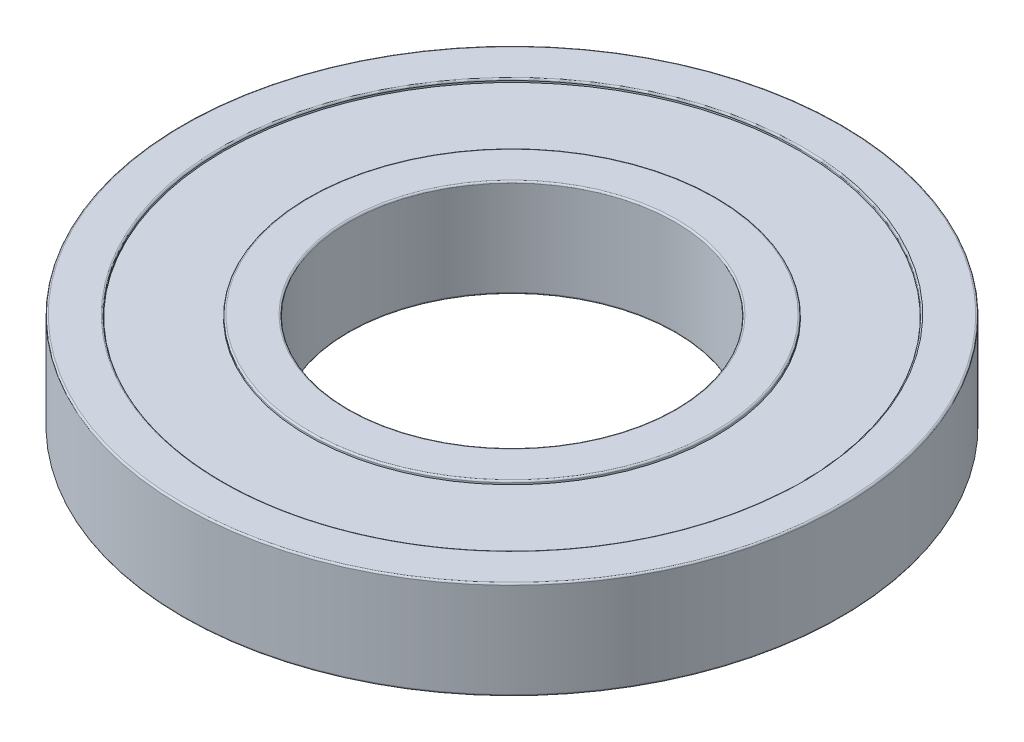
ISO-10303-21;
HEADER;
FILE_DESCRIPTION(('STEP AP214'),'2;1');
FILE_NAME('part.step','',(''),(''),'','','');
FILE_SCHEMA(('AUTOMOTIVE_DESIGN { 1 0 10303 214 1 1 1 1 }'));
ENDSEC;
DATA;
#1=APPLICATION_CONTEXT('core data for automotive mechanical design processes');
#2=APPLICATION_PROTOCOL_DEFINITION('international standard','automotive_design',2000,#1);
#3=PRODUCT_CONTEXT('',#1,'mechanical');
#4=PRODUCT('Part','Part','',(#3));
#5=PRODUCT_RELATED_PRODUCT_CATEGORY('part','',(#4));
#6=PRODUCT_DEFINITION_FORMATION('','',#4);
#7=PRODUCT_DEFINITION_CONTEXT('part definition',#1,'design');
#8=PRODUCT_DEFINITION('design','',#6,#7);
#9=PRODUCT_DEFINITION_SHAPE('','',#8);
#10=(LENGTH_UNIT() NAMED_UNIT(*) SI_UNIT(.MILLI.,.METRE.));
#11=(NAMED_UNIT(*) PLANE_ANGLE_UNIT() SI_UNIT($,.RADIAN.));
#12=(NAMED_UNIT(*) SI_UNIT($,.STERADIAN.) SOLID_ANGLE_UNIT());
#13=UNCERTAINTY_MEASURE_WITH_UNIT(LENGTH_MEASURE(1.E-05),#10,'distance_accuracy_value','');
#14=(GEOMETRIC_REPRESENTATION_CONTEXT(3) GLOBAL_UNCERTAINTY_ASSIGNED_CONTEXT((#13)) GLOBAL_UNIT_ASSIGNED_CONTEXT((#10,
#11,#12)) REPRESENTATION_CONTEXT('',''));
#15=CARTESIAN_POINT('',(0.,0.,0.));
#16=DIRECTION('',(0.,0.,1.));
#17=DIRECTION('',(1.,0.,0.));
#18=AXIS2_PLACEMENT_3D('',#15,#16,#17);
#19=CARTESIAN_POINT('',(0.,0.,0.));
#20=DIRECTION('',(0.,-1.,0.));
#21=DIRECTION('',(0.,0.,-1.));
#22=AXIS2_PLACEMENT_3D('',#19,#20,#21);
#23=CYLINDRICAL_SURFACE('',#22,6.25);
#24=CARTESIAN_POINT('',(0.,-1.45,0.));
#25=DIRECTION('',(0.,1.,0.));
#26=DIRECTION('',(0.,0.,1.));
#27=AXIS2_PLACEMENT_3D('',#24,#25,#26);
#28=CIRCLE('',#27,6.25);
#29=CARTESIAN_POINT('',(0.,-1.45,6.25));
#30=VERTEX_POINT('',#29);
#31=EDGE_CURVE('E77',#30,#30,#28,.T.);
#32=ORIENTED_EDGE('',*,*,#31,.T.);
#33=EDGE_LOOP('',(#32));
#34=FACE_BOUND('',#33,.T.);
#35=CARTESIAN_POINT('',(0.,-1.4,0.));
#36=DIRECTION('',(0.,1.,0.));
#37=DIRECTION('',(0.,0.,1.));
#38=AXIS2_PLACEMENT_3D('',#35,#36,#37);
#39=CIRCLE('',#38,6.25);
#40=CARTESIAN_POINT('',(0.,-1.4,6.25));
#41=VERTEX_POINT('',#40);
#42=EDGE_CURVE('E10',#41,#41,#39,.T.);
#43=ORIENTED_EDGE('',*,*,#42,.F.);
#44=EDGE_LOOP('',(#43));
#45=FACE_BOUND('',#44,.T.);
#46=ADVANCED_FACE('F35',(#34,#45),#23,.T.);
#47=CARTESIAN_POINT('',(0.,0.,0.));
#48=DIRECTION('',(0.,-1.,0.));
#49=DIRECTION('',(0.,0.,-1.));
#50=AXIS2_PLACEMENT_3D('',#47,#48,#49);
#51=CYLINDRICAL_SURFACE('',#50,8.84807621135332);
#52=CARTESIAN_POINT('',(0.,-1.45,0.));
#53=DIRECTION('',(0.,1.,0.));
#54=DIRECTION('',(0.,0.,1.));
#55=AXIS2_PLACEMENT_3D('',#52,#53,#54);
#56=CIRCLE('',#55,8.84807621135332);
#57=CARTESIAN_POINT('',(0.,-1.45,8.84807621135332));
#58=VERTEX_POINT('',#57);
#59=EDGE_CURVE('E107',#58,#58,#56,.F.);
#60=ORIENTED_EDGE('',*,*,#59,.T.);
#61=EDGE_LOOP('',(#60));
#62=FACE_BOUND('',#61,.T.);
#63=CARTESIAN_POINT('',(0.,-1.4,0.));
#64=DIRECTION('',(0.,1.,0.));
#65=DIRECTION('',(0.,0.,1.));
#66=AXIS2_PLACEMENT_3D('',#63,#64,#65);
#67=CIRCLE('',#66,8.84807621135332);
#68=CARTESIAN_POINT('',(0.,-1.4,8.84807621135332));
#69=VERTEX_POINT('',#68);
#70=EDGE_CURVE('E47',#69,#69,#67,.F.);
#71=ORIENTED_EDGE('',*,*,#70,.F.);
#72=EDGE_LOOP('',(#71));
#73=FACE_BOUND('',#72,.T.);
#74=ADVANCED_FACE('F143',(#62,#73),#51,.F.);
#75=CARTESIAN_POINT('',(0.,0.,0.));
#76=DIRECTION('',(0.,-1.,0.));
#77=DIRECTION('',(0.,0.,-1.));
#78=AXIS2_PLACEMENT_3D('',#75,#76,#77);
#79=CYLINDRICAL_SURFACE('',#78,6.25);
#80=CARTESIAN_POINT('',(0.,1.45,0.));
#81=DIRECTION('',(0.,-1.,0.));
#82=DIRECTION('',(0.,0.,-1.));
#83=AXIS2_PLACEMENT_3D('',#80,#81,#82);
#84=CIRCLE('',#83,6.25);
#85=CARTESIAN_POINT('',(0.,1.45,-6.25));
#86=VERTEX_POINT('',#85);
#87=EDGE_CURVE('E62',#86,#86,#84,.T.);
#88=ORIENTED_EDGE('',*,*,#87,.T.);
#89=EDGE_LOOP('',(#88));
#90=FACE_BOUND('',#89,.T.);
#91=CARTESIAN_POINT('',(0.,1.4,0.));
#92=DIRECTION('',(0.,-1.,0.));
#93=DIRECTION('',(0.,0.,-1.));
#94=AXIS2_PLACEMENT_3D('',#91,#92,#93);
#95=CIRCLE('',#94,6.25);
#96=CARTESIAN_POINT('',(0.,1.4,-6.25));
#97=VERTEX_POINT('',#96);
#98=EDGE_CURVE('E59',#97,#97,#95,.T.);
#99=ORIENTED_EDGE('',*,*,#98,.F.);
#100=EDGE_LOOP('',(#99));
#101=FACE_BOUND('',#100,.T.);
#102=ADVANCED_FACE('F157',(#90,#101),#79,.T.);
#103=CARTESIAN_POINT('',(-5.,1.5,0.));
#104=DIRECTION('',(0.,-1.,0.));
#105=DIRECTION('',(0.,0.,-1.));
#106=AXIS2_PLACEMENT_3D('',#103,#104,#105);
#107=PLANE('',#106);
#108=CARTESIAN_POINT('',(0.,1.5,0.));
#109=DIRECTION('',(0.,-1.,0.));
#110=DIRECTION('',(0.,0.,-1.));
#111=AXIS2_PLACEMENT_3D('',#108,#109,#110);
#112=CIRCLE('',#111,5.05);
#113=CARTESIAN_POINT('',(0.,1.5,-5.05));
#114=VERTEX_POINT('',#113);
#115=EDGE_CURVE('E65',#114,#114,#112,.T.);
#116=ORIENTED_EDGE('',*,*,#115,.T.);
#117=EDGE_LOOP('',(#116));
#118=FACE_BOUND('',#117,.T.);
#119=CARTESIAN_POINT('',(0.,1.5,0.));
#120=DIRECTION('',(0.,-1.,0.));
#121=DIRECTION('',(0.,0.,-1.));
#122=AXIS2_PLACEMENT_3D('',#119,#120,#121);
#123=CIRCLE('',#122,6.2);
#124=CARTESIAN_POINT('',(0.,1.5,-6.2));
#125=VERTEX_POINT('',#124);
#126=EDGE_CURVE('E68',#125,#125,#123,.F.);
#127=ORIENTED_EDGE('',*,*,#126,.T.);
#128=EDGE_LOOP('',(#127));
#129=FACE_BOUND('',#128,.T.);
#130=ADVANCED_FACE('F217',(#118,#129),#107,.F.);
#131=CARTESIAN_POINT('',(0.,0.,0.));
#132=DIRECTION('',(0.,-1.,0.));
#133=DIRECTION('',(0.,0.,-1.));
#134=AXIS2_PLACEMENT_3D('',#131,#132,#133);
#135=CYLINDRICAL_SURFACE('',#134,5.);
#136=CARTESIAN_POINT('',(0.,-1.45,0.));
#137=DIRECTION('',(0.,1.,0.));
#138=DIRECTION('',(0.,0.,1.));
#139=AXIS2_PLACEMENT_3D('',#136,#137,#138);
#140=CIRCLE('',#139,5.);
#141=CARTESIAN_POINT('',(0.,-1.45,5.));
#142=VERTEX_POINT('',#141);
#143=EDGE_CURVE('E71',#142,#142,#140,.F.);
#144=ORIENTED_EDGE('',*,*,#143,.T.);
#145=EDGE_LOOP('',(#144));
#146=FACE_BOUND('',#145,.T.);
#147=CARTESIAN_POINT('',(0.,1.45,0.));
#148=DIRECTION('',(0.,-1.,0.));
#149=DIRECTION('',(0.,0.,-1.));
#150=AXIS2_PLACEMENT_3D('',#147,#148,#149);
#151=CIRCLE('',#150,5.);
#152=CARTESIAN_POINT('',(0.,1.45,-5.));
#153=VERTEX_POINT('',#152);
#154=EDGE_CURVE('E74',#153,#153,#151,.F.);
#155=ORIENTED_EDGE('',*,*,#154,.T.);
#156=EDGE_LOOP('',(#155));
#157=FACE_BOUND('',#156,.T.);
#158=ADVANCED_FACE('F213',(#146,#157),#135,.F.);
#159=CARTESIAN_POINT('',(-5.,-1.5,0.));
#160=DIRECTION('',(0.,1.,0.));
#161=DIRECTION('',(0.,0.,1.));
#162=AXIS2_PLACEMENT_3D('',#159,#160,#161);
#163=PLANE('',#162);
#164=CARTESIAN_POINT('',(0.,-1.5,0.));
#165=DIRECTION('',(0.,1.,0.));
#166=DIRECTION('',(0.,0.,1.));
#167=AXIS2_PLACEMENT_3D('',#164,#165,#166);
#168=CIRCLE('',#167,6.2);
#169=CARTESIAN_POINT('',(0.,-1.5,6.2));
#170=VERTEX_POINT('',#169);
#171=EDGE_CURVE('E80',#170,#170,#168,.F.);
#172=ORIENTED_EDGE('',*,*,#171,.T.);
#173=EDGE_LOOP('',(#172));
#174=FACE_BOUND('',#173,.T.);
#175=CARTESIAN_POINT('',(0.,-1.5,0.));
#176=DIRECTION('',(0.,1.,0.));
#177=DIRECTION('',(0.,0.,1.));
#178=AXIS2_PLACEMENT_3D('',#175,#176,#177);
#179=CIRCLE('',#178,5.05);
#180=CARTESIAN_POINT('',(0.,-1.5,5.05));
#181=VERTEX_POINT('',#180);
#182=EDGE_CURVE('E83',#181,#181,#179,.T.);
#183=ORIENTED_EDGE('',*,*,#182,.T.);
#184=EDGE_LOOP('',(#183));
#185=FACE_BOUND('',#184,.T.);
#186=ADVANCED_FACE('F209',(#174,#185),#163,.F.);
#187=CARTESIAN_POINT('',(0.,-1.45,0.));
#188=DIRECTION('',(0.,1.,0.));
#189=DIRECTION('',(0.,0.,1.));
#190=AXIS2_PLACEMENT_3D('',#187,#188,#189);
#191=TOROIDAL_SURFACE('',#190,6.2,0.05);
#192=ORIENTED_EDGE('',*,*,#31,.F.);
#193=EDGE_LOOP('',(#192));
#194=FACE_BOUND('',#193,.T.);
#195=ORIENTED_EDGE('',*,*,#171,.F.);
#196=EDGE_LOOP('',(#195));
#197=FACE_BOUND('',#196,.T.);
#198=ADVANCED_FACE('F212',(#194,#197),#191,.T.);
#199=CARTESIAN_POINT('',(0.,-1.45,0.));
#200=DIRECTION('',(0.,1.,0.));
#201=DIRECTION('',(0.,0.,1.));
#202=AXIS2_PLACEMENT_3D('',#199,#200,#201);
#203=TOROIDAL_SURFACE('',#202,5.05,0.05);
#204=ORIENTED_EDGE('',*,*,#182,.F.);
#205=EDGE_LOOP('',(#204));
#206=FACE_BOUND('',#205,.T.);
#207=ORIENTED_EDGE('',*,*,#143,.F.);
#208=EDGE_LOOP('',(#207));
#209=FACE_BOUND('',#208,.T.);
#210=ADVANCED_FACE('F224',(#206,#209),#203,.T.);
#211=CARTESIAN_POINT('',(0.,1.45,0.));
#212=DIRECTION('',(0.,-1.,0.));
#213=DIRECTION('',(0.,0.,-1.));
#214=AXIS2_PLACEMENT_3D('',#211,#212,#213);
#215=TOROIDAL_SURFACE('',#214,5.05,0.05);
#216=ORIENTED_EDGE('',*,*,#154,.F.);
#217=EDGE_LOOP('',(#216));
#218=FACE_BOUND('',#217,.T.);
#219=ORIENTED_EDGE('',*,*,#115,.F.);
#220=EDGE_LOOP('',(#219));
#221=FACE_BOUND('',#220,.T.);
#222=ADVANCED_FACE('F227',(#218,#221),#215,.T.);
#223=CARTESIAN_POINT('',(0.,1.45,0.));
#224=DIRECTION('',(0.,-1.,0.));
#225=DIRECTION('',(0.,0.,-1.));
#226=AXIS2_PLACEMENT_3D('',#223,#224,#225);
#227=TOROIDAL_SURFACE('',#226,6.2,0.05);
#228=ORIENTED_EDGE('',*,*,#126,.F.);
#229=EDGE_LOOP('',(#228));
#230=FACE_BOUND('',#229,.T.);
#231=ORIENTED_EDGE('',*,*,#87,.F.);
#232=EDGE_LOOP('',(#231));
#233=FACE_BOUND('',#232,.T.);
#234=ADVANCED_FACE('F37',(#230,#233),#227,.T.);
#235=CARTESIAN_POINT('',(-8.84807621135332,1.4,0.));
#236=DIRECTION('',(0.,-1.,0.));
#237=DIRECTION('',(0.,0.,-1.));
#238=AXIS2_PLACEMENT_3D('',#235,#236,#237);
#239=PLANE('',#238);
#240=CARTESIAN_POINT('',(0.,1.4,0.));
#241=DIRECTION('',(0.,-1.,0.));
#242=DIRECTION('',(0.,0.,-1.));
#243=AXIS2_PLACEMENT_3D('',#240,#241,#242);
#244=CIRCLE('',#243,8.84807621135332);
#245=CARTESIAN_POINT('',(0.,1.4,-8.84807621135332));
#246=VERTEX_POINT('',#245);
#247=EDGE_CURVE('E92',#246,#246,#244,.T.);
#248=ORIENTED_EDGE('',*,*,#247,.F.);
#249=EDGE_LOOP('',(#248));
#250=FACE_BOUND('',#249,.T.);
#251=ORIENTED_EDGE('',*,*,#98,.T.);
#252=EDGE_LOOP('',(#251));
#253=FACE_BOUND('',#252,.T.);
#254=ADVANCED_FACE('F195',(#250,#253),#239,.F.);
#255=CARTESIAN_POINT('',(0.,0.,0.));
#256=DIRECTION('',(0.,-1.,0.));
#257=DIRECTION('',(0.,0.,-1.));
#258=AXIS2_PLACEMENT_3D('',#255,#256,#257);
#259=CYLINDRICAL_SURFACE('',#258,8.84807621135332);
#260=CARTESIAN_POINT('',(0.,1.45,0.));
#261=DIRECTION('',(0.,-1.,0.));
#262=DIRECTION('',(0.,0.,-1.));
#263=AXIS2_PLACEMENT_3D('',#260,#261,#262);
#264=CIRCLE('',#263,8.84807621135332);
#265=CARTESIAN_POINT('',(0.,1.45,-8.84807621135332));
#266=VERTEX_POINT('',#265);
#267=EDGE_CURVE('E98',#266,#266,#264,.F.);
#268=ORIENTED_EDGE('',*,*,#267,.T.);
#269=EDGE_LOOP('',(#268));
#270=FACE_BOUND('',#269,.T.);
#271=ORIENTED_EDGE('',*,*,#247,.T.);
#272=EDGE_LOOP('',(#271));
#273=FACE_BOUND('',#272,.T.);
#274=ADVANCED_FACE('F164',(#270,#273),#259,.F.);
#275=CARTESIAN_POINT('',(-10.0980762113533,1.5,0.));
#276=DIRECTION('',(0.,-1.,0.));
#277=DIRECTION('',(0.,0.,-1.));
#278=AXIS2_PLACEMENT_3D('',#275,#276,#277);
#279=PLANE('',#278);
#280=CARTESIAN_POINT('',(0.,1.5,0.));
#281=DIRECTION('',(0.,-1.,0.));
#282=DIRECTION('',(0.,0.,-1.));
#283=AXIS2_PLACEMENT_3D('',#280,#281,#282);
#284=CIRCLE('',#283,8.89807621135332);
#285=CARTESIAN_POINT('',(0.,1.5,-8.89807621135332));
#286=VERTEX_POINT('',#285);
#287=EDGE_CURVE('E101',#286,#286,#284,.T.);
#288=ORIENTED_EDGE('',*,*,#287,.T.);
#289=EDGE_LOOP('',(#288));
#290=FACE_BOUND('',#289,.T.);
#291=CARTESIAN_POINT('',(0.,1.5,0.));
#292=DIRECTION('',(0.,-1.,0.));
#293=DIRECTION('',(0.,0.,-1.));
#294=AXIS2_PLACEMENT_3D('',#291,#292,#293);
#295=CIRCLE('',#294,10.0480762113533);
#296=CARTESIAN_POINT('',(0.,1.5,-10.0480762113533));
#297=VERTEX_POINT('',#296);
#298=EDGE_CURVE('E104',#297,#297,#295,.F.);
#299=ORIENTED_EDGE('',*,*,#298,.T.);
#300=EDGE_LOOP('',(#299));
#301=FACE_BOUND('',#300,.T.);
#302=ADVANCED_FACE('F176',(#290,#301),#279,.F.);
#303=CARTESIAN_POINT('',(0.,0.,0.));
#304=DIRECTION('',(0.,-1.,0.));
#305=DIRECTION('',(0.,0.,-1.));
#306=AXIS2_PLACEMENT_3D('',#303,#304,#305);
#307=CYLINDRICAL_SURFACE('',#306,10.0980762113533);
#308=CARTESIAN_POINT('',(0.,-1.45,0.));
#309=DIRECTION('',(0.,1.,0.));
#310=DIRECTION('',(0.,0.,1.));
#311=AXIS2_PLACEMENT_3D('',#308,#309,#310);
#312=CIRCLE('',#311,10.0980762113533);
#313=CARTESIAN_POINT('',(0.,-1.45,10.0980762113533));
#314=VERTEX_POINT('',#313);
#315=EDGE_CURVE('E110',#314,#314,#312,.T.);
#316=ORIENTED_EDGE('',*,*,#315,.T.);
#317=EDGE_LOOP('',(#316));
#318=FACE_BOUND('',#317,.T.);
#319=CARTESIAN_POINT('',(0.,1.45,0.));
#320=DIRECTION('',(0.,-1.,0.));
#321=DIRECTION('',(0.,0.,-1.));
#322=AXIS2_PLACEMENT_3D('',#319,#320,#321);
#323=CIRCLE('',#322,10.0980762113533);
#324=CARTESIAN_POINT('',(0.,1.45,-10.0980762113533));
#325=VERTEX_POINT('',#324);
#326=EDGE_CURVE('E113',#325,#325,#323,.T.);
#327=ORIENTED_EDGE('',*,*,#326,.T.);
#328=EDGE_LOOP('',(#327));
#329=FACE_BOUND('',#328,.T.);
#330=ADVANCED_FACE('F172',(#318,#329),#307,.T.);
#331=CARTESIAN_POINT('',(-10.0980762113533,-1.5,0.));
#332=DIRECTION('',(0.,1.,0.));
#333=DIRECTION('',(0.,0.,1.));
#334=AXIS2_PLACEMENT_3D('',#331,#332,#333);
#335=PLANE('',#334);
#336=CARTESIAN_POINT('',(0.,-1.5,0.));
#337=DIRECTION('',(0.,1.,0.));
#338=DIRECTION('',(0.,0.,1.));
#339=AXIS2_PLACEMENT_3D('',#336,#337,#338);
#340=CIRCLE('',#339,10.0480762113533);
#341=CARTESIAN_POINT('',(0.,-1.5,10.0480762113533));
#342=VERTEX_POINT('',#341);
#343=EDGE_CURVE('E116',#342,#342,#340,.F.);
#344=ORIENTED_EDGE('',*,*,#343,.T.);
#345=EDGE_LOOP('',(#344));
#346=FACE_BOUND('',#345,.T.);
#347=CARTESIAN_POINT('',(0.,-1.5,0.));
#348=DIRECTION('',(0.,1.,0.));
#349=DIRECTION('',(0.,0.,1.));
#350=AXIS2_PLACEMENT_3D('',#347,#348,#349);
#351=CIRCLE('',#350,8.89807621135332);
#352=CARTESIAN_POINT('',(0.,-1.5,8.89807621135332));
#353=VERTEX_POINT('',#352);
#354=EDGE_CURVE('E119',#353,#353,#351,.T.);
#355=ORIENTED_EDGE('',*,*,#354,.T.);
#356=EDGE_LOOP('',(#355));
#357=FACE_BOUND('',#356,.T.);
#358=ADVANCED_FACE('F168',(#346,#357),#335,.F.);
#359=CARTESIAN_POINT('',(0.,-1.45,0.));
#360=DIRECTION('',(0.,1.,0.));
#361=DIRECTION('',(0.,0.,1.));
#362=AXIS2_PLACEMENT_3D('',#359,#360,#361);
#363=TOROIDAL_SURFACE('',#362,10.0480762113533,0.05);
#364=ORIENTED_EDGE('',*,*,#315,.F.);
#365=EDGE_LOOP('',(#364));
#366=FACE_BOUND('',#365,.T.);
#367=ORIENTED_EDGE('',*,*,#343,.F.);
#368=EDGE_LOOP('',(#367));
#369=FACE_BOUND('',#368,.T.);
#370=ADVANCED_FACE('F171',(#366,#369),#363,.T.);
#371=CARTESIAN_POINT('',(0.,-1.45,0.));
#372=DIRECTION('',(0.,1.,0.));
#373=DIRECTION('',(0.,0.,1.));
#374=AXIS2_PLACEMENT_3D('',#371,#372,#373);
#375=TOROIDAL_SURFACE('',#374,8.89807621135332,0.05);
#376=ORIENTED_EDGE('',*,*,#354,.F.);
#377=EDGE_LOOP('',(#376));
#378=FACE_BOUND('',#377,.T.);
#379=ORIENTED_EDGE('',*,*,#59,.F.);
#380=EDGE_LOOP('',(#379));
#381=FACE_BOUND('',#380,.T.);
#382=ADVANCED_FACE('F183',(#378,#381),#375,.T.);
#383=CARTESIAN_POINT('',(0.,1.45,0.));
#384=DIRECTION('',(0.,-1.,0.));
#385=DIRECTION('',(0.,0.,-1.));
#386=AXIS2_PLACEMENT_3D('',#383,#384,#385);
#387=TOROIDAL_SURFACE('',#386,8.89807621135332,0.05);
#388=ORIENTED_EDGE('',*,*,#267,.F.);
#389=EDGE_LOOP('',(#388));
#390=FACE_BOUND('',#389,.T.);
#391=ORIENTED_EDGE('',*,*,#287,.F.);
#392=EDGE_LOOP('',(#391));
#393=FACE_BOUND('',#392,.T.);
#394=ADVANCED_FACE('F187',(#390,#393),#387,.T.);
#395=CARTESIAN_POINT('',(0.,1.45,0.));
#396=DIRECTION('',(0.,-1.,0.));
#397=DIRECTION('',(0.,0.,-1.));
#398=AXIS2_PLACEMENT_3D('',#395,#396,#397);
#399=TOROIDAL_SURFACE('',#398,10.0480762113533,0.05);
#400=ORIENTED_EDGE('',*,*,#298,.F.);
#401=EDGE_LOOP('',(#400));
#402=FACE_BOUND('',#401,.T.);
#403=ORIENTED_EDGE('',*,*,#326,.F.);
#404=EDGE_LOOP('',(#403));
#405=FACE_BOUND('',#404,.T.);
#406=ADVANCED_FACE('F161',(#402,#405),#399,.T.);
#407=CARTESIAN_POINT('',(-8.84807621135332,-1.4,0.));
#408=DIRECTION('',(0.,1.,0.));
#409=DIRECTION('',(0.,0.,1.));
#410=AXIS2_PLACEMENT_3D('',#407,#408,#409);
#411=PLANE('',#410);
#412=ORIENTED_EDGE('',*,*,#42,.T.);
#413=EDGE_LOOP('',(#412));
#414=FACE_BOUND('',#413,.T.);
#415=ORIENTED_EDGE('',*,*,#70,.T.);
#416=EDGE_LOOP('',(#415));
#417=FACE_BOUND('',#416,.T.);
#418=ADVANCED_FACE('F159',(#414,#417),#411,.F.);
#419=CLOSED_SHELL('',(#46,#74,#102,#130,#158,#186,#198,#210,#222,#234,#254,#274,#302,#330,#358,
#370,#382,#394,#406,#418));
#420=CARTESIAN_POINT('',(-6.25,-1.3,0.));
#421=DIRECTION('',(0.,-1.,0.));
#422=DIRECTION('',(0.,0.,-1.));
#423=AXIS2_PLACEMENT_3D('',#420,#421,#422);
#424=PLANE('',#423);
#425=CARTESIAN_POINT('',(0.,-1.3,0.));
#426=DIRECTION('',(0.,-1.,0.));
#427=DIRECTION('',(0.,0.,-1.));
#428=AXIS2_PLACEMENT_3D('',#425,#426,#427);
#429=CIRCLE('',#428,8.84807621135332);
#430=CARTESIAN_POINT('',(0.,-1.3,-8.84807621135332));
#431=VERTEX_POINT('',#430);
#432=EDGE_CURVE('E51',#431,#431,#429,.F.);
#433=ORIENTED_EDGE('',*,*,#432,.T.);
#434=EDGE_LOOP('',(#433));
#435=FACE_BOUND('',#434,.T.);
#436=CARTESIAN_POINT('',(0.,-1.3,0.));
#437=DIRECTION('',(0.,-1.,0.));
#438=DIRECTION('',(0.,0.,-1.));
#439=AXIS2_PLACEMENT_3D('',#436,#437,#438);
#440=CIRCLE('',#439,6.25);
#441=CARTESIAN_POINT('',(0.,-1.3,-6.25));
#442=VERTEX_POINT('',#441);
#443=EDGE_CURVE('E43',#442,#442,#440,.T.);
#444=ORIENTED_EDGE('',*,*,#443,.T.);
#445=EDGE_LOOP('',(#444));
#446=FACE_BOUND('',#445,.T.);
#447=ADVANCED_FACE('F146',(#435,#446),#424,.F.);
#448=CARTESIAN_POINT('',(0.,0.75,0.));
#449=DIRECTION('',(0.,-1.,0.));
#450=DIRECTION('',(0.,0.,-1.));
#451=AXIS2_PLACEMENT_3D('',#448,#449,#450);
#452=CIRCLE('',#451,6.25);
#453=CARTESIAN_POINT('',(0.,0.75,-6.25));
#454=VERTEX_POINT('',#453);
#455=EDGE_CURVE('E89',#454,#454,#452,.T.);
#456=ORIENTED_EDGE('',*,*,#455,.F.);
#457=EDGE_LOOP('',(#456));
#458=FACE_BOUND('',#457,.T.);
#459=CARTESIAN_POINT('',(0.,1.3,0.));
#460=DIRECTION('',(0.,1.,0.));
#461=DIRECTION('',(0.,0.,1.));
#462=AXIS2_PLACEMENT_3D('',#459,#460,#461);
#463=CIRCLE('',#462,6.25);
#464=CARTESIAN_POINT('',(0.,1.3,6.25));
#465=VERTEX_POINT('',#464);
#466=EDGE_CURVE('E56',#465,#465,#463,.T.);
#467=ORIENTED_EDGE('',*,*,#466,.F.);
#468=EDGE_LOOP('',(#467));
#469=FACE_BOUND('',#468,.T.);
#470=ADVANCED_FACE('F148',(#458,#469),#79,.T.);
#471=CARTESIAN_POINT('',(0.,0.,0.));
#472=DIRECTION('',(0.,-1.,0.));
#473=DIRECTION('',(0.,0.,-1.));
#474=AXIS2_PLACEMENT_3D('',#471,#472,#473);
#475=TOROIDAL_SURFACE('',#474,7.54903810567666,1.5);
#476=CARTESIAN_POINT('',(0.,-0.75,0.));
#477=DIRECTION('',(0.,-1.,0.));
#478=DIRECTION('',(0.,0.,-1.));
#479=AXIS2_PLACEMENT_3D('',#476,#477,#478);
#480=CIRCLE('',#479,6.25);
#481=CARTESIAN_POINT('',(0.,-0.75,-6.25));
#482=VERTEX_POINT('',#481);
#483=EDGE_CURVE('E86',#482,#482,#480,.T.);
#484=ORIENTED_EDGE('',*,*,#483,.F.);
#485=EDGE_LOOP('',(#484));
#486=FACE_BOUND('',#485,.T.);
#487=ORIENTED_EDGE('',*,*,#455,.T.);
#488=EDGE_LOOP('',(#487));
#489=FACE_BOUND('',#488,.T.);
#490=ADVANCED_FACE('F154',(#486,#489),#475,.F.);
#491=ORIENTED_EDGE('',*,*,#483,.T.);
#492=EDGE_LOOP('',(#491));
#493=FACE_BOUND('',#492,.T.);
#494=ORIENTED_EDGE('',*,*,#443,.F.);
#495=EDGE_LOOP('',(#494));
#496=FACE_BOUND('',#495,.T.);
#497=ADVANCED_FACE('F200',(#493,#496),#23,.T.);
#498=CARTESIAN_POINT('',(-6.25,1.3,0.));
#499=DIRECTION('',(0.,1.,0.));
#500=DIRECTION('',(0.,0.,1.));
#501=AXIS2_PLACEMENT_3D('',#498,#499,#500);
#502=PLANE('',#501);
#503=ORIENTED_EDGE('',*,*,#466,.T.);
#504=EDGE_LOOP('',(#503));
#505=FACE_BOUND('',#504,.T.);
#506=CARTESIAN_POINT('',(0.,1.3,0.));
#507=DIRECTION('',(0.,1.,0.));
#508=DIRECTION('',(0.,0.,1.));
#509=AXIS2_PLACEMENT_3D('',#506,#507,#508);
#510=CIRCLE('',#509,8.84807621135332);
#511=CARTESIAN_POINT('',(0.,1.3,8.84807621135332));
#512=VERTEX_POINT('',#511);
#513=EDGE_CURVE('E95',#512,#512,#510,.T.);
#514=ORIENTED_EDGE('',*,*,#513,.F.);
#515=EDGE_LOOP('',(#514));
#516=FACE_BOUND('',#515,.T.);
#517=ADVANCED_FACE('F163',(#505,#516),#502,.F.);
#518=CARTESIAN_POINT('',(0.,0.749999999999999,0.));
#519=DIRECTION('',(0.,-1.,0.));
#520=DIRECTION('',(0.,0.,-1.));
#521=AXIS2_PLACEMENT_3D('',#518,#519,#520);
#522=CIRCLE('',#521,8.84807621135332);
#523=CARTESIAN_POINT('',(0.,0.749999999999999,-8.84807621135332));
#524=VERTEX_POINT('',#523);
#525=EDGE_CURVE('E125',#524,#524,#522,.T.);
#526=ORIENTED_EDGE('',*,*,#525,.T.);
#527=EDGE_LOOP('',(#526));
#528=FACE_BOUND('',#527,.T.);
#529=ORIENTED_EDGE('',*,*,#513,.T.);
#530=EDGE_LOOP('',(#529));
#531=FACE_BOUND('',#530,.T.);
#532=ADVANCED_FACE('F129',(#528,#531),#259,.F.);
#533=CARTESIAN_POINT('',(0.,0.,0.));
#534=DIRECTION('',(0.,-1.,0.));
#535=DIRECTION('',(0.,0.,-1.));
#536=AXIS2_PLACEMENT_3D('',#533,#534,#535);
#537=TOROIDAL_SURFACE('',#536,7.54903810567666,1.5);
#538=ORIENTED_EDGE('',*,*,#525,.F.);
#539=EDGE_LOOP('',(#538));
#540=FACE_BOUND('',#539,.T.);
#541=CARTESIAN_POINT('',(0.,-0.749999999999999,0.));
#542=DIRECTION('',(0.,-1.,0.));
#543=DIRECTION('',(0.,0.,-1.));
#544=AXIS2_PLACEMENT_3D('',#541,#542,#543);
#545=CIRCLE('',#544,8.84807621135332);
#546=CARTESIAN_POINT('',(0.,-0.749999999999999,-8.84807621135332));
#547=VERTEX_POINT('',#546);
#548=EDGE_CURVE('E122',#547,#547,#545,.T.);
#549=ORIENTED_EDGE('',*,*,#548,.T.);
#550=EDGE_LOOP('',(#549));
#551=FACE_BOUND('',#550,.T.);
#552=ADVANCED_FACE('F132',(#540,#551),#537,.F.);
#553=ORIENTED_EDGE('',*,*,#548,.F.);
#554=EDGE_LOOP('',(#553));
#555=FACE_BOUND('',#554,.T.);
#556=ORIENTED_EDGE('',*,*,#432,.F.);
#557=EDGE_LOOP('',(#556));
#558=FACE_BOUND('',#557,.T.);
#559=ADVANCED_FACE('F135',(#555,#558),#51,.F.);
#560=CLOSED_SHELL('',(#447,#470,#490,#497,#517,#532,#552,#559));
#561=ORIENTED_CLOSED_SHELL('',*,#560,.T.);
#562=BREP_WITH_VOIDS('B2',#419,(#561));
#563=ADVANCED_BREP_SHAPE_REPRESENTATION('',(#18,#562),#14);
#564=SHAPE_DEFINITION_REPRESENTATION(#9,#563);
ENDSEC;
END-ISO-10303-21;
